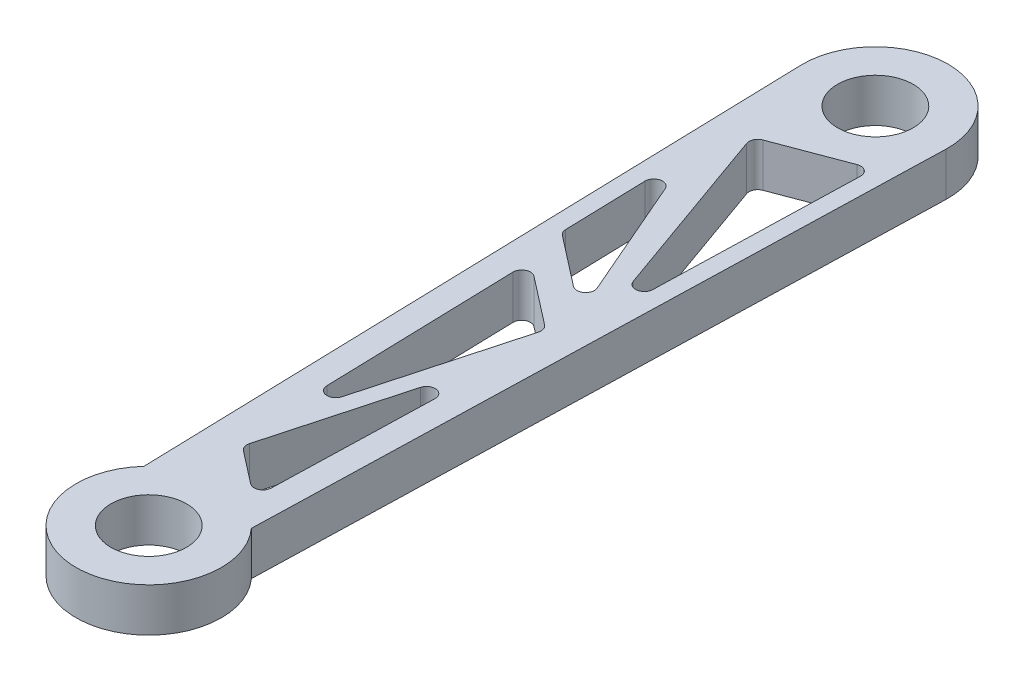
ISO-10303-21;
HEADER;
FILE_DESCRIPTION(('STEP AP214'),'2;1');
FILE_NAME('part.step','',(''),(''),'','','');
FILE_SCHEMA(('AUTOMOTIVE_DESIGN { 1 0 10303 214 1 1 1 1 }'));
ENDSEC;
DATA;
#1=APPLICATION_CONTEXT('core data for automotive mechanical design processes');
#2=APPLICATION_PROTOCOL_DEFINITION('international standard','automotive_design',2000,#1);
#3=PRODUCT_CONTEXT('',#1,'mechanical');
#4=PRODUCT('Part','Part','',(#3));
#5=PRODUCT_RELATED_PRODUCT_CATEGORY('part','',(#4));
#6=PRODUCT_DEFINITION_FORMATION('','',#4);
#7=PRODUCT_DEFINITION_CONTEXT('part definition',#1,'design');
#8=PRODUCT_DEFINITION('design','',#6,#7);
#9=PRODUCT_DEFINITION_SHAPE('','',#8);
#10=(LENGTH_UNIT() NAMED_UNIT(*) SI_UNIT(.MILLI.,.METRE.));
#11=(NAMED_UNIT(*) PLANE_ANGLE_UNIT() SI_UNIT($,.RADIAN.));
#12=(NAMED_UNIT(*) SI_UNIT($,.STERADIAN.) SOLID_ANGLE_UNIT());
#13=UNCERTAINTY_MEASURE_WITH_UNIT(LENGTH_MEASURE(1.E-05),#10,'distance_accuracy_value','');
#14=(GEOMETRIC_REPRESENTATION_CONTEXT(3) GLOBAL_UNCERTAINTY_ASSIGNED_CONTEXT((#13)) GLOBAL_UNIT_ASSIGNED_CONTEXT((#10,
#11,#12)) REPRESENTATION_CONTEXT('',''));
#15=CARTESIAN_POINT('',(0.,0.,0.));
#16=DIRECTION('',(0.,0.,1.));
#17=DIRECTION('',(1.,0.,0.));
#18=AXIS2_PLACEMENT_3D('',#15,#16,#17);
#19=CARTESIAN_POINT('',(0.,15.,0.));
#20=DIRECTION('',(0.,1.,0.));
#21=DIRECTION('',(0.,0.,1.));
#22=AXIS2_PLACEMENT_3D('',#19,#20,#21);
#23=PLANE('',#22);
#24=DIRECTION('',(0.028,0.,0.999607923137867));
#25=VECTOR('',#24,1.);
#26=CARTESIAN_POINT('',(-17.9929426164816,15.,0.504));
#27=LINE('',#26,#25);
#28=CARTESIAN_POINT('',(-24.9901980784467,15.,-249.3));
#29=VERTEX_POINT('',#28);
#30=CARTESIAN_POINT('',(-18.4787244605227,15.,-16.8385492935727));
#31=VERTEX_POINT('',#30);
#32=EDGE_CURVE('E241',#29,#31,#27,.T.);
#33=ORIENTED_EDGE('',*,*,#32,.T.);
#34=CARTESIAN_POINT('',(0.,15.,0.));
#35=DIRECTION('',(0.,1.,0.));
#36=DIRECTION('',(0.,0.,1.));
#37=AXIS2_PLACEMENT_3D('',#34,#35,#36);
#38=CIRCLE('',#37,25.);
#39=CARTESIAN_POINT('',(18.4787244605227,15.,-16.8385492935727));
#40=VERTEX_POINT('',#39);
#41=EDGE_CURVE('E226',#31,#40,#38,.T.);
#42=ORIENTED_EDGE('',*,*,#41,.T.);
#43=DIRECTION('',(0.028,0.,-0.999607923137867));
#44=VECTOR('',#43,1.);
#45=CARTESIAN_POINT('',(17.9929426164816,15.,0.504));
#46=LINE('',#45,#44);
#47=CARTESIAN_POINT('',(24.9901980784467,15.,-249.3));
#48=VERTEX_POINT('',#47);
#49=EDGE_CURVE('E54',#40,#48,#46,.T.);
#50=ORIENTED_EDGE('',*,*,#49,.T.);
#51=CARTESIAN_POINT('',(0.,15.,-250.));
#52=DIRECTION('',(0.,1.,0.));
#53=DIRECTION('',(0.,0.,-1.));
#54=AXIS2_PLACEMENT_3D('',#51,#52,#53);
#55=CIRCLE('',#54,25.);
#56=EDGE_CURVE('E223',#48,#29,#55,.T.);
#57=ORIENTED_EDGE('',*,*,#56,.T.);
#58=EDGE_LOOP('',(#33,#42,#50,#57));
#59=FACE_BOUND('',#58,.T.);
#60=DIRECTION('',(-0.789952118654972,0.,-0.613168533302649));
#61=VECTOR('',#60,1.);
#62=CARTESIAN_POINT('',(-13.0503430260789,15.,-144.472367447696));
#63=LINE('',#62,#61);
#64=CARTESIAN_POINT('',(8.34644282073467,15.,-127.863973742239));
#65=VERTEX_POINT('',#64);
#66=CARTESIAN_POINT('',(-8.03421610357234,15.,-140.578800843722));
#67=VERTEX_POINT('',#66);
#68=EDGE_CURVE('E257',#65,#67,#63,.T.);
#69=ORIENTED_EDGE('',*,*,#68,.F.);
#70=CARTESIAN_POINT('',(6.50693722082673,15.,-125.494117386274));
#71=DIRECTION('',(0.,1.,0.));
#72=DIRECTION('',(0.,0.,1.));
#73=AXIS2_PLACEMENT_3D('',#70,#71,#72);
#74=CIRCLE('',#73,3.);
#75=CARTESIAN_POINT('',(9.40048928643597,15.,-124.70205902756));
#76=VERTEX_POINT('',#75);
#77=EDGE_CURVE('E393',#65,#76,#74,.F.);
#78=ORIENTED_EDGE('',*,*,#77,.T.);
#79=DIRECTION('',(-0.264019452904616,0.,0.964517355203081));
#80=VECTOR('',#79,1.);
#81=CARTESIAN_POINT('',(9.60137553040454,15.,-125.43593778762));
#82=LINE('',#81,#80);
#83=CARTESIAN_POINT('',(-5.1364514497771,15.,-71.5956250986117));
#84=VERTEX_POINT('',#83);
#85=EDGE_CURVE('E325',#76,#84,#82,.T.);
#86=ORIENTED_EDGE('',*,*,#85,.T.);
#87=CARTESIAN_POINT('',(-8.03000351538634,15.,-72.3876834573255));
#88=DIRECTION('',(0.,1.,0.));
#89=DIRECTION('',(0.,0.,1.));
#90=AXIS2_PLACEMENT_3D('',#87,#88,#89);
#91=CIRCLE('',#90,3.);
#92=CARTESIAN_POINT('',(-11.0288272847999,15.,-72.3036834573255));
#93=VERTEX_POINT('',#92);
#94=EDGE_CURVE('E391',#84,#93,#91,.F.);
#95=ORIENTED_EDGE('',*,*,#94,.T.);
#96=DIRECTION('',(0.028,0.,0.999607923137867));
#97=VECTOR('',#96,1.);
#98=CARTESIAN_POINT('',(-10.1751058159417,15.,-41.8255854421963));
#99=LINE('',#98,#97);
#100=CARTESIAN_POINT('',(-12.8725454728939,15.,-138.124944487757));
#101=VERTEX_POINT('',#100);
#102=EDGE_CURVE('E331',#101,#93,#99,.T.);
#103=ORIENTED_EDGE('',*,*,#102,.F.);
#104=CARTESIAN_POINT('',(-9.87372170348028,15.,-138.208944487757));
#105=DIRECTION('',(0.,1.,0.));
#106=DIRECTION('',(0.,0.,1.));
#107=AXIS2_PLACEMENT_3D('',#104,#105,#106);
#108=CIRCLE('',#107,3.);
#109=EDGE_CURVE('E440',#101,#67,#108,.F.);
#110=ORIENTED_EDGE('',*,*,#109,.T.);
#111=EDGE_LOOP('',(#69,#78,#86,#95,#103,#110));
#112=FACE_BOUND('',#111,.T.);
#113=DIRECTION('',(0.789952118654972,0.,0.613168533302648));
#114=VECTOR('',#113,1.);
#115=CARTESIAN_POINT('',(9.74205890204631,15.,-26.365688077189));
#116=LINE('',#115,#114);
#117=CARTESIAN_POINT('',(-6.02662104066256,15.,-38.6054911288633));
#118=VERTEX_POINT('',#117);
#119=CARTESIAN_POINT('',(5.06935441375542,15.,-29.9926868407602));
#120=VERTEX_POINT('',#119);
#121=EDGE_CURVE('E342',#118,#120,#116,.T.);
#122=ORIENTED_EDGE('',*,*,#121,.F.);
#123=CARTESIAN_POINT('',(-4.18711544075462,15.,-40.9753474848282));
#124=DIRECTION('',(0.,1.,0.));
#125=DIRECTION('',(0.,0.,1.));
#126=AXIS2_PLACEMENT_3D('',#123,#124,#125);
#127=CIRCLE('',#126,3.);
#128=CARTESIAN_POINT('',(-7.08066750636386,15.,-41.767405843542));
#129=VERTEX_POINT('',#128);
#130=EDGE_CURVE('E383',#118,#129,#127,.F.);
#131=ORIENTED_EDGE('',*,*,#130,.T.);
#132=DIRECTION('',(0.264019452904616,0.,-0.964517355203082));
#133=VECTOR('',#132,1.);
#134=CARTESIAN_POINT('',(15.388479661623,15.,-123.851821070192));
#135=LINE('',#134,#133);
#136=CARTESIAN_POINT('',(5.54894809663971,15.,-87.9059888328851));
#137=VERTEX_POINT('',#136);
#138=EDGE_CURVE('E320',#129,#137,#135,.T.);
#139=ORIENTED_EDGE('',*,*,#138,.T.);
#140=CARTESIAN_POINT('',(8.44250016224896,15.,-87.1139304741712));
#141=DIRECTION('',(0.,1.,0.));
#142=DIRECTION('',(0.,0.,1.));
#143=AXIS2_PLACEMENT_3D('',#140,#141,#142);
#144=CIRCLE('',#143,3.);
#145=CARTESIAN_POINT('',(11.4413239316626,15.,-87.0299304741712));
#146=VERTEX_POINT('',#145);
#147=EDGE_CURVE('E365',#137,#146,#144,.F.);
#148=ORIENTED_EDGE('',*,*,#147,.T.);
#149=DIRECTION('',(0.028,0.,-0.999607923137867));
#150=VECTOR('',#149,1.);
#151=CARTESIAN_POINT('',(12.4949275960138,15.,-124.643879428906));
#152=LINE('',#151,#150);
#153=CARTESIAN_POINT('',(9.90768378307697,15.,-32.2785431967251));
#154=VERTEX_POINT('',#153);
#155=EDGE_CURVE('E262',#154,#146,#152,.T.);
#156=ORIENTED_EDGE('',*,*,#155,.F.);
#157=CARTESIAN_POINT('',(6.90886001366337,15.,-32.3625431967251));
#158=DIRECTION('',(0.,1.,0.));
#159=DIRECTION('',(0.,0.,1.));
#160=AXIS2_PLACEMENT_3D('',#157,#158,#159);
#161=CIRCLE('',#160,3.);
#162=EDGE_CURVE('E446',#154,#120,#161,.F.);
#163=ORIENTED_EDGE('',*,*,#162,.T.);
#164=EDGE_LOOP('',(#122,#131,#139,#148,#156,#163));
#165=FACE_BOUND('',#164,.T.);
#166=CARTESIAN_POINT('',(0.,15.,-250.));
#167=DIRECTION('',(0.,1.,0.));
#168=DIRECTION('',(0.,0.,1.));
#169=AXIS2_PLACEMENT_3D('',#166,#167,#168);
#170=CIRCLE('',#169,13.);
#171=CARTESIAN_POINT('',(0.,15.,-237.));
#172=VERTEX_POINT('',#171);
#173=EDGE_CURVE('E313',#172,#172,#170,.T.);
#174=ORIENTED_EDGE('',*,*,#173,.F.);
#175=EDGE_LOOP('',(#174));
#176=FACE_BOUND('',#175,.T.);
#177=DIRECTION('',(-0.397525373663088,0.,-0.917591182005376));
#178=VECTOR('',#177,1.);
#179=CARTESIAN_POINT('',(-17.7049416979852,15.,-203.5));
#180=LINE('',#179,#178);
#181=CARTESIAN_POINT('',(6.37692660368526,15.,-147.912831321415));
#182=VERTEX_POINT('',#181);
#183=CARTESIAN_POINT('',(-11.5175293173122,15.,-189.217854969559));
#184=VERTEX_POINT('',#183);
#185=EDGE_CURVE('E294',#182,#184,#180,.T.);
#186=ORIENTED_EDGE('',*,*,#185,.F.);
#187=CARTESIAN_POINT('',(3.62415305766913,15.,-146.720255200426));
#188=DIRECTION('',(0.,1.,0.));
#189=DIRECTION('',(0.,0.,1.));
#190=AXIS2_PLACEMENT_3D('',#187,#188,#189);
#191=CIRCLE('',#190,3.);
#192=CARTESIAN_POINT('',(1.7846474577612,15.,-144.350398844461));
#193=VERTEX_POINT('',#192);
#194=EDGE_CURVE('E455',#182,#193,#191,.F.);
#195=ORIENTED_EDGE('',*,*,#194,.T.);
#196=DIRECTION('',(0.789952118654972,0.,0.613168533302648));
#197=VECTOR('',#196,1.);
#198=CARTESIAN_POINT('',(11.0288712194541,15.,-137.174942267257));
#199=LINE('',#198,#197);
#200=CARTESIAN_POINT('',(-15.3248149033725,15.,-157.630930276462));
#201=VERTEX_POINT('',#200);
#202=EDGE_CURVE('E290',#201,#193,#199,.T.);
#203=ORIENTED_EDGE('',*,*,#202,.F.);
#204=CARTESIAN_POINT('',(-13.4853093034645,15.,-160.000786632427));
#205=DIRECTION('',(0.,1.,0.));
#206=DIRECTION('',(0.,0.,1.));
#207=AXIS2_PLACEMENT_3D('',#204,#205,#206);
#208=CIRCLE('',#207,3.);
#209=CARTESIAN_POINT('',(-16.4841330728781,15.,-159.916786632427));
#210=VERTEX_POINT('',#209);
#211=EDGE_CURVE('E463',#201,#210,#208,.F.);
#212=ORIENTED_EDGE('',*,*,#211,.T.);
#213=DIRECTION('',(0.028,0.,0.999607923137867));
#214=VECTOR('',#213,1.);
#215=CARTESIAN_POINT('',(-16.4444474873704,15.,-158.5));
#216=LINE('',#215,#214);
#217=CARTESIAN_POINT('',(-17.2691266327419,15.,-187.94127884857));
#218=VERTEX_POINT('',#217);
#219=EDGE_CURVE('E301',#218,#210,#216,.T.);
#220=ORIENTED_EDGE('',*,*,#219,.F.);
#221=CARTESIAN_POINT('',(-14.2703028633283,15.,-188.02527884857));
#222=DIRECTION('',(0.,1.,0.));
#223=DIRECTION('',(0.,0.,1.));
#224=AXIS2_PLACEMENT_3D('',#221,#222,#223);
#225=CIRCLE('',#224,3.);
#226=EDGE_CURVE('E467',#218,#184,#225,.F.);
#227=ORIENTED_EDGE('',*,*,#226,.T.);
#228=EDGE_LOOP('',(#186,#195,#203,#212,#220,#227));
#229=FACE_BOUND('',#228,.T.);
#230=DIRECTION('',(0.335469277320512,0.,0.94205114721763));
#231=VECTOR('',#230,1.);
#232=CARTESIAN_POINT('',(-12.,15.,-219.5));
#233=LINE('',#232,#231);
#234=CARTESIAN_POINT('',(-11.0122686365186,15.,-216.726293055678));
#235=VERTEX_POINT('',#234);
#236=CARTESIAN_POINT('',(10.5780075140444,15.,-156.097359822692));
#237=VERTEX_POINT('',#236);
#238=EDGE_CURVE('E269',#235,#237,#233,.T.);
#239=ORIENTED_EDGE('',*,*,#238,.F.);
#240=CARTESIAN_POINT('',(-8.18611519486575,15.,-217.73270088764));
#241=DIRECTION('',(0.,1.,0.));
#242=DIRECTION('',(0.,0.,1.));
#243=AXIS2_PLACEMENT_3D('',#240,#241,#242);
#244=CIRCLE('',#243,3.);
#245=CARTESIAN_POINT('',(-9.24527953761205,15.,-220.539508842427));
#246=VERTEX_POINT('',#245);
#247=EDGE_CURVE('E471',#235,#246,#244,.F.);
#248=ORIENTED_EDGE('',*,*,#247,.T.);
#249=DIRECTION('',(-0.93560265159562,0.,0.353054780915433));
#250=VECTOR('',#249,1.);
#251=CARTESIAN_POINT('',(18.4752437155831,15.,-231.));
#252=LINE('',#251,#250);
#253=CARTESIAN_POINT('',(14.2920646215098,15.,-229.421454475285));
#254=VERTEX_POINT('',#253);
#255=EDGE_CURVE('E265',#254,#246,#252,.T.);
#256=ORIENTED_EDGE('',*,*,#255,.F.);
#257=CARTESIAN_POINT('',(15.3512289642561,15.,-226.614646520498));
#258=DIRECTION('',(0.,1.,0.));
#259=DIRECTION('',(0.,0.,1.));
#260=AXIS2_PLACEMENT_3D('',#257,#258,#259);
#261=CIRCLE('',#260,3.);
#262=CARTESIAN_POINT('',(18.3500527336697,15.,-226.530646520498));
#263=VERTEX_POINT('',#262);
#264=EDGE_CURVE('E475',#254,#263,#261,.F.);
#265=ORIENTED_EDGE('',*,*,#264,.T.);
#266=DIRECTION('',(0.028,0.,-0.999607923137867));
#267=VECTOR('',#266,1.);
#268=CARTESIAN_POINT('',(15.9542552943535,15.,-141.));
#269=LINE('',#268,#267);
#270=CARTESIAN_POINT('',(16.4029847251109,15.,-157.019767654654));
#271=VERTEX_POINT('',#270);
#272=EDGE_CURVE('E276',#271,#263,#269,.T.);
#273=ORIENTED_EDGE('',*,*,#272,.F.);
#274=CARTESIAN_POINT('',(13.4041609556973,15.,-157.103767654654));
#275=DIRECTION('',(0.,1.,0.));
#276=DIRECTION('',(0.,0.,1.));
#277=AXIS2_PLACEMENT_3D('',#274,#275,#276);
#278=CIRCLE('',#277,3.);
#279=EDGE_CURVE('E459',#271,#237,#278,.F.);
#280=ORIENTED_EDGE('',*,*,#279,.T.);
#281=EDGE_LOOP('',(#239,#248,#256,#265,#273,#280));
#282=FACE_BOUND('',#281,.T.);
#283=CARTESIAN_POINT('',(0.,15.,0.));
#284=DIRECTION('',(0.,1.,0.));
#285=DIRECTION('',(0.,0.,1.));
#286=AXIS2_PLACEMENT_3D('',#283,#284,#285);
#287=CIRCLE('',#286,13.);
#288=CARTESIAN_POINT('',(0.,15.,13.));
#289=VERTEX_POINT('',#288);
#290=EDGE_CURVE('E419',#289,#289,#287,.T.);
#291=ORIENTED_EDGE('',*,*,#290,.F.);
#292=EDGE_LOOP('',(#291));
#293=FACE_BOUND('',#292,.T.);
#294=ADVANCED_FACE('F39',(#59,#112,#165,#176,#229,#282,#293),#23,.T.);
#295=CARTESIAN_POINT('',(0.,0.,0.));
#296=DIRECTION('',(0.,1.,0.));
#297=DIRECTION('',(0.,0.,1.));
#298=AXIS2_PLACEMENT_3D('',#295,#296,#297);
#299=PLANE('',#298);
#300=DIRECTION('',(0.028,0.,0.999607923137867));
#301=VECTOR('',#300,1.);
#302=CARTESIAN_POINT('',(-10.1751058159417,0.,-41.8255854421963));
#303=LINE('',#302,#301);
#304=CARTESIAN_POINT('',(-12.8725454728939,0.,-138.124944487757));
#305=VERTEX_POINT('',#304);
#306=CARTESIAN_POINT('',(-11.0288272847999,0.,-72.3036834573255));
#307=VERTEX_POINT('',#306);
#308=EDGE_CURVE('E261',#305,#307,#303,.T.);
#309=ORIENTED_EDGE('',*,*,#308,.T.);
#310=CARTESIAN_POINT('',(-8.03000351538634,0.,-72.3876834573255));
#311=DIRECTION('',(0.,1.,0.));
#312=DIRECTION('',(0.,0.,1.));
#313=AXIS2_PLACEMENT_3D('',#310,#311,#312);
#314=CIRCLE('',#313,3.);
#315=CARTESIAN_POINT('',(-5.1364514497771,0.,-71.5956250986117));
#316=VERTEX_POINT('',#315);
#317=EDGE_CURVE('E389',#307,#316,#314,.T.);
#318=ORIENTED_EDGE('',*,*,#317,.T.);
#319=DIRECTION('',(0.264019452904616,0.,-0.964517355203081));
#320=VECTOR('',#319,1.);
#321=CARTESIAN_POINT('',(9.60137553040454,0.,-125.43593778762));
#322=LINE('',#321,#320);
#323=CARTESIAN_POINT('',(9.40048928643597,0.,-124.70205902756));
#324=VERTEX_POINT('',#323);
#325=EDGE_CURVE('E328',#316,#324,#322,.T.);
#326=ORIENTED_EDGE('',*,*,#325,.T.);
#327=CARTESIAN_POINT('',(6.50693722082673,0.,-125.494117386274));
#328=DIRECTION('',(0.,1.,0.));
#329=DIRECTION('',(0.,0.,1.));
#330=AXIS2_PLACEMENT_3D('',#327,#328,#329);
#331=CIRCLE('',#330,3.);
#332=CARTESIAN_POINT('',(8.34644282073467,0.,-127.863973742239));
#333=VERTEX_POINT('',#332);
#334=EDGE_CURVE('E47',#324,#333,#331,.T.);
#335=ORIENTED_EDGE('',*,*,#334,.T.);
#336=DIRECTION('',(-0.789952118654972,0.,-0.613168533302649));
#337=VECTOR('',#336,1.);
#338=CARTESIAN_POINT('',(-13.0503430260789,0.,-144.472367447696));
#339=LINE('',#338,#337);
#340=CARTESIAN_POINT('',(-8.03421610357234,0.,-140.578800843722));
#341=VERTEX_POINT('',#340);
#342=EDGE_CURVE('E285',#333,#341,#339,.T.);
#343=ORIENTED_EDGE('',*,*,#342,.T.);
#344=CARTESIAN_POINT('',(-9.87372170348028,0.,-138.208944487757));
#345=DIRECTION('',(0.,1.,0.));
#346=DIRECTION('',(0.,0.,1.));
#347=AXIS2_PLACEMENT_3D('',#344,#345,#346);
#348=CIRCLE('',#347,3.);
#349=EDGE_CURVE('E438',#341,#305,#348,.T.);
#350=ORIENTED_EDGE('',*,*,#349,.T.);
#351=EDGE_LOOP('',(#309,#318,#326,#335,#343,#350));
#352=FACE_BOUND('',#351,.T.);
#353=DIRECTION('',(0.028,0.,-0.999607923137867));
#354=VECTOR('',#353,1.);
#355=CARTESIAN_POINT('',(12.4949275960138,0.,-124.643879428906));
#356=LINE('',#355,#354);
#357=CARTESIAN_POINT('',(9.90768378307697,0.,-32.2785431967251));
#358=VERTEX_POINT('',#357);
#359=CARTESIAN_POINT('',(11.4413239316626,0.,-87.0299304741712));
#360=VERTEX_POINT('',#359);
#361=EDGE_CURVE('E336',#358,#360,#356,.T.);
#362=ORIENTED_EDGE('',*,*,#361,.T.);
#363=CARTESIAN_POINT('',(8.44250016224896,0.,-87.1139304741712));
#364=DIRECTION('',(0.,1.,0.));
#365=DIRECTION('',(0.,0.,1.));
#366=AXIS2_PLACEMENT_3D('',#363,#364,#365);
#367=CIRCLE('',#366,3.);
#368=CARTESIAN_POINT('',(5.54894809663971,0.,-87.9059888328851));
#369=VERTEX_POINT('',#368);
#370=EDGE_CURVE('E366',#360,#369,#367,.T.);
#371=ORIENTED_EDGE('',*,*,#370,.T.);
#372=DIRECTION('',(-0.264019452904616,0.,0.964517355203082));
#373=VECTOR('',#372,1.);
#374=CARTESIAN_POINT('',(15.388479661623,0.,-123.851821070192));
#375=LINE('',#374,#373);
#376=CARTESIAN_POINT('',(-7.08066750636386,0.,-41.767405843542));
#377=VERTEX_POINT('',#376);
#378=EDGE_CURVE('E324',#369,#377,#375,.T.);
#379=ORIENTED_EDGE('',*,*,#378,.T.);
#380=CARTESIAN_POINT('',(-4.18711544075462,0.,-40.9753474848282));
#381=DIRECTION('',(0.,1.,0.));
#382=DIRECTION('',(0.,0.,1.));
#383=AXIS2_PLACEMENT_3D('',#380,#381,#382);
#384=CIRCLE('',#383,3.);
#385=CARTESIAN_POINT('',(-6.02662104066256,0.,-38.6054911288633));
#386=VERTEX_POINT('',#385);
#387=EDGE_CURVE('E385',#377,#386,#384,.T.);
#388=ORIENTED_EDGE('',*,*,#387,.T.);
#389=DIRECTION('',(0.789952118654972,0.,0.613168533302648));
#390=VECTOR('',#389,1.);
#391=CARTESIAN_POINT('',(9.74205890204631,0.,-26.365688077189));
#392=LINE('',#391,#390);
#393=CARTESIAN_POINT('',(5.06935441375542,0.,-29.9926868407602));
#394=VERTEX_POINT('',#393);
#395=EDGE_CURVE('E334',#386,#394,#392,.T.);
#396=ORIENTED_EDGE('',*,*,#395,.T.);
#397=CARTESIAN_POINT('',(6.90886001366337,0.,-32.3625431967251));
#398=DIRECTION('',(0.,1.,0.));
#399=DIRECTION('',(0.,0.,1.));
#400=AXIS2_PLACEMENT_3D('',#397,#398,#399);
#401=CIRCLE('',#400,3.);
#402=EDGE_CURVE('E444',#394,#358,#401,.T.);
#403=ORIENTED_EDGE('',*,*,#402,.T.);
#404=EDGE_LOOP('',(#362,#371,#379,#388,#396,#403));
#405=FACE_BOUND('',#404,.T.);
#406=DIRECTION('',(0.028,0.,0.999607923137867));
#407=VECTOR('',#406,1.);
#408=CARTESIAN_POINT('',(-16.4444474873704,0.,-158.5));
#409=LINE('',#408,#407);
#410=CARTESIAN_POINT('',(-17.2691266327419,0.,-187.94127884857));
#411=VERTEX_POINT('',#410);
#412=CARTESIAN_POINT('',(-16.4841330728781,0.,-159.916786632427));
#413=VERTEX_POINT('',#412);
#414=EDGE_CURVE('E295',#411,#413,#409,.T.);
#415=ORIENTED_EDGE('',*,*,#414,.T.);
#416=CARTESIAN_POINT('',(-13.4853093034645,0.,-160.000786632427));
#417=DIRECTION('',(0.,1.,0.));
#418=DIRECTION('',(0.,0.,1.));
#419=AXIS2_PLACEMENT_3D('',#416,#417,#418);
#420=CIRCLE('',#419,3.);
#421=CARTESIAN_POINT('',(-15.3248149033725,0.,-157.630930276462));
#422=VERTEX_POINT('',#421);
#423=EDGE_CURVE('E465',#413,#422,#420,.T.);
#424=ORIENTED_EDGE('',*,*,#423,.T.);
#425=DIRECTION('',(0.789952118654972,0.,0.613168533302648));
#426=VECTOR('',#425,1.);
#427=CARTESIAN_POINT('',(11.0288712194541,0.,-137.174942267257));
#428=LINE('',#427,#426);
#429=CARTESIAN_POINT('',(1.7846474577612,0.,-144.350398844461));
#430=VERTEX_POINT('',#429);
#431=EDGE_CURVE('E280',#422,#430,#428,.T.);
#432=ORIENTED_EDGE('',*,*,#431,.T.);
#433=CARTESIAN_POINT('',(3.62415305766913,0.,-146.720255200426));
#434=DIRECTION('',(0.,1.,0.));
#435=DIRECTION('',(0.,0.,1.));
#436=AXIS2_PLACEMENT_3D('',#433,#434,#435);
#437=CIRCLE('',#436,3.);
#438=CARTESIAN_POINT('',(6.37692660368526,0.,-147.912831321415));
#439=VERTEX_POINT('',#438);
#440=EDGE_CURVE('E457',#430,#439,#437,.T.);
#441=ORIENTED_EDGE('',*,*,#440,.T.);
#442=DIRECTION('',(-0.397525373663088,0.,-0.917591182005376));
#443=VECTOR('',#442,1.);
#444=CARTESIAN_POINT('',(-17.7049416979852,0.,-203.5));
#445=LINE('',#444,#443);
#446=CARTESIAN_POINT('',(-11.5175293173122,0.,-189.217854969559));
#447=VERTEX_POINT('',#446);
#448=EDGE_CURVE('E308',#439,#447,#445,.T.);
#449=ORIENTED_EDGE('',*,*,#448,.T.);
#450=CARTESIAN_POINT('',(-14.2703028633283,0.,-188.02527884857));
#451=DIRECTION('',(0.,1.,0.));
#452=DIRECTION('',(0.,0.,1.));
#453=AXIS2_PLACEMENT_3D('',#450,#451,#452);
#454=CIRCLE('',#453,3.);
#455=EDGE_CURVE('E469',#447,#411,#454,.T.);
#456=ORIENTED_EDGE('',*,*,#455,.T.);
#457=EDGE_LOOP('',(#415,#424,#432,#441,#449,#456));
#458=FACE_BOUND('',#457,.T.);
#459=DIRECTION('',(0.028,0.,-0.999607923137867));
#460=VECTOR('',#459,1.);
#461=CARTESIAN_POINT('',(17.9929426164816,0.,0.504));
#462=LINE('',#461,#460);
#463=CARTESIAN_POINT('',(18.4787244605227,0.,-16.8385492935727));
#464=VERTEX_POINT('',#463);
#465=CARTESIAN_POINT('',(24.9901980784467,0.,-249.3));
#466=VERTEX_POINT('',#465);
#467=EDGE_CURVE('E232',#464,#466,#462,.T.);
#468=ORIENTED_EDGE('',*,*,#467,.F.);
#469=CARTESIAN_POINT('',(0.,0.,0.));
#470=DIRECTION('',(0.,1.,0.));
#471=DIRECTION('',(0.,0.,1.));
#472=AXIS2_PLACEMENT_3D('',#469,#470,#471);
#473=CIRCLE('',#472,25.);
#474=CARTESIAN_POINT('',(-18.4787244605227,0.,-16.8385492935727));
#475=VERTEX_POINT('',#474);
#476=EDGE_CURVE('E519',#464,#475,#473,.F.);
#477=ORIENTED_EDGE('',*,*,#476,.T.);
#478=DIRECTION('',(0.028,0.,0.999607923137867));
#479=VECTOR('',#478,1.);
#480=CARTESIAN_POINT('',(-17.9929426164816,0.,0.504));
#481=LINE('',#480,#479);
#482=CARTESIAN_POINT('',(-24.9901980784467,0.,-249.3));
#483=VERTEX_POINT('',#482);
#484=EDGE_CURVE('E227',#483,#475,#481,.T.);
#485=ORIENTED_EDGE('',*,*,#484,.F.);
#486=CARTESIAN_POINT('',(0.,0.,-250.));
#487=DIRECTION('',(0.,1.,0.));
#488=DIRECTION('',(0.,0.,-1.));
#489=AXIS2_PLACEMENT_3D('',#486,#487,#488);
#490=CIRCLE('',#489,25.);
#491=EDGE_CURVE('E510',#466,#483,#490,.T.);
#492=ORIENTED_EDGE('',*,*,#491,.F.);
#493=EDGE_LOOP('',(#468,#477,#485,#492));
#494=FACE_BOUND('',#493,.T.);
#495=CARTESIAN_POINT('',(0.,0.,-250.));
#496=DIRECTION('',(0.,1.,0.));
#497=DIRECTION('',(0.,0.,1.));
#498=AXIS2_PLACEMENT_3D('',#495,#496,#497);
#499=CIRCLE('',#498,13.);
#500=CARTESIAN_POINT('',(0.,0.,-237.));
#501=VERTEX_POINT('',#500);
#502=EDGE_CURVE('E305',#501,#501,#499,.T.);
#503=ORIENTED_EDGE('',*,*,#502,.T.);
#504=EDGE_LOOP('',(#503));
#505=FACE_BOUND('',#504,.T.);
#506=DIRECTION('',(0.028,0.,-0.999607923137867));
#507=VECTOR('',#506,1.);
#508=CARTESIAN_POINT('',(15.9542552943535,0.,-141.));
#509=LINE('',#508,#507);
#510=CARTESIAN_POINT('',(16.4029847251109,0.,-157.019767654654));
#511=VERTEX_POINT('',#510);
#512=CARTESIAN_POINT('',(18.3500527336697,0.,-226.530646520498));
#513=VERTEX_POINT('',#512);
#514=EDGE_CURVE('E270',#511,#513,#509,.T.);
#515=ORIENTED_EDGE('',*,*,#514,.T.);
#516=CARTESIAN_POINT('',(15.3512289642561,0.,-226.614646520498));
#517=DIRECTION('',(0.,1.,0.));
#518=DIRECTION('',(0.,0.,1.));
#519=AXIS2_PLACEMENT_3D('',#516,#517,#518);
#520=CIRCLE('',#519,3.);
#521=CARTESIAN_POINT('',(14.2920646215098,0.,-229.421454475285));
#522=VERTEX_POINT('',#521);
#523=EDGE_CURVE('E477',#513,#522,#520,.T.);
#524=ORIENTED_EDGE('',*,*,#523,.T.);
#525=DIRECTION('',(-0.93560265159562,0.,0.353054780915433));
#526=VECTOR('',#525,1.);
#527=CARTESIAN_POINT('',(18.4752437155831,0.,-231.));
#528=LINE('',#527,#526);
#529=CARTESIAN_POINT('',(-9.24527953761205,0.,-220.539508842427));
#530=VERTEX_POINT('',#529);
#531=EDGE_CURVE('E281',#522,#530,#528,.T.);
#532=ORIENTED_EDGE('',*,*,#531,.T.);
#533=CARTESIAN_POINT('',(-8.18611519486575,0.,-217.73270088764));
#534=DIRECTION('',(0.,1.,0.));
#535=DIRECTION('',(0.,0.,1.));
#536=AXIS2_PLACEMENT_3D('',#533,#534,#535);
#537=CIRCLE('',#536,3.);
#538=CARTESIAN_POINT('',(-11.0122686365186,0.,-216.726293055678));
#539=VERTEX_POINT('',#538);
#540=EDGE_CURVE('E473',#530,#539,#537,.T.);
#541=ORIENTED_EDGE('',*,*,#540,.T.);
#542=DIRECTION('',(0.335469277320512,0.,0.94205114721763));
#543=VECTOR('',#542,1.);
#544=CARTESIAN_POINT('',(-12.,0.,-219.5));
#545=LINE('',#544,#543);
#546=CARTESIAN_POINT('',(10.5780075140444,0.,-156.097359822692));
#547=VERTEX_POINT('',#546);
#548=EDGE_CURVE('E284',#539,#547,#545,.T.);
#549=ORIENTED_EDGE('',*,*,#548,.T.);
#550=CARTESIAN_POINT('',(13.4041609556973,0.,-157.103767654654));
#551=DIRECTION('',(0.,1.,0.));
#552=DIRECTION('',(0.,0.,1.));
#553=AXIS2_PLACEMENT_3D('',#550,#551,#552);
#554=CIRCLE('',#553,3.);
#555=EDGE_CURVE('E461',#547,#511,#554,.T.);
#556=ORIENTED_EDGE('',*,*,#555,.T.);
#557=EDGE_LOOP('',(#515,#524,#532,#541,#549,#556));
#558=FACE_BOUND('',#557,.T.);
#559=CARTESIAN_POINT('',(0.,0.,0.));
#560=DIRECTION('',(0.,1.,0.));
#561=DIRECTION('',(0.,0.,1.));
#562=AXIS2_PLACEMENT_3D('',#559,#560,#561);
#563=CIRCLE('',#562,13.);
#564=CARTESIAN_POINT('',(0.,0.,13.));
#565=VERTEX_POINT('',#564);
#566=EDGE_CURVE('E417',#565,#565,#563,.T.);
#567=ORIENTED_EDGE('',*,*,#566,.T.);
#568=EDGE_LOOP('',(#567));
#569=FACE_BOUND('',#568,.T.);
#570=ADVANCED_FACE('F397',(#352,#405,#458,#494,#505,#558,#569),#299,.F.);
#571=CARTESIAN_POINT('',(17.9929426164816,15.,0.504));
#572=DIRECTION('',(-0.999607923137867,0.,-0.028));
#573=DIRECTION('',(-0.028,0.,0.999607923137867));
#574=AXIS2_PLACEMENT_3D('',#571,#572,#573);
#575=PLANE('',#574);
#576=ORIENTED_EDGE('',*,*,#49,.F.);
#577=DIRECTION('',(0.,1.,0.));
#578=VECTOR('',#577,1.);
#579=CARTESIAN_POINT('',(18.4787244605227,-70.7106781186548,-16.8385492935727));
#580=LINE('',#579,#578);
#581=EDGE_CURVE('E58',#40,#464,#580,.F.);
#582=ORIENTED_EDGE('',*,*,#581,.T.);
#583=ORIENTED_EDGE('',*,*,#467,.T.);
#584=DIRECTION('',(0.,-1.,0.));
#585=VECTOR('',#584,1.);
#586=CARTESIAN_POINT('',(24.9901980784467,15.,-249.3));
#587=LINE('',#586,#585);
#588=EDGE_CURVE('E230',#48,#466,#587,.T.);
#589=ORIENTED_EDGE('',*,*,#588,.F.);
#590=EDGE_LOOP('',(#576,#582,#583,#589));
#591=FACE_BOUND('',#590,.T.);
#592=ADVANCED_FACE('F231',(#591),#575,.F.);
#593=CARTESIAN_POINT('',(0.,15.,-250.));
#594=DIRECTION('',(0.,-1.,0.));
#595=DIRECTION('',(0.,0.,-1.));
#596=AXIS2_PLACEMENT_3D('',#593,#594,#595);
#597=CYLINDRICAL_SURFACE('',#596,25.);
#598=ORIENTED_EDGE('',*,*,#491,.T.);
#599=DIRECTION('',(0.,-1.,0.));
#600=VECTOR('',#599,1.);
#601=CARTESIAN_POINT('',(-24.9901980784467,15.,-249.3));
#602=LINE('',#601,#600);
#603=EDGE_CURVE('E236',#29,#483,#602,.T.);
#604=ORIENTED_EDGE('',*,*,#603,.F.);
#605=ORIENTED_EDGE('',*,*,#56,.F.);
#606=ORIENTED_EDGE('',*,*,#588,.T.);
#607=EDGE_LOOP('',(#598,#604,#605,#606));
#608=FACE_BOUND('',#607,.T.);
#609=ADVANCED_FACE('F238',(#608),#597,.T.);
#610=CARTESIAN_POINT('',(-17.9929426164816,15.,0.504));
#611=DIRECTION('',(0.999607923137867,0.,-0.028));
#612=DIRECTION('',(-0.028,0.,-0.999607923137867));
#613=AXIS2_PLACEMENT_3D('',#610,#611,#612);
#614=PLANE('',#613);
#615=ORIENTED_EDGE('',*,*,#484,.T.);
#616=DIRECTION('',(0.,1.,0.));
#617=VECTOR('',#616,1.);
#618=CARTESIAN_POINT('',(-18.4787244605227,-70.7106781186548,-16.8385492935727));
#619=LINE('',#618,#617);
#620=EDGE_CURVE('E12',#475,#31,#619,.T.);
#621=ORIENTED_EDGE('',*,*,#620,.T.);
#622=ORIENTED_EDGE('',*,*,#32,.F.);
#623=ORIENTED_EDGE('',*,*,#603,.T.);
#624=EDGE_LOOP('',(#615,#621,#622,#623));
#625=FACE_BOUND('',#624,.T.);
#626=ADVANCED_FACE('F514',(#625),#614,.F.);
#627=CARTESIAN_POINT('',(0.,15.,-250.));
#628=DIRECTION('',(0.,-1.,0.));
#629=DIRECTION('',(0.,0.,-1.));
#630=AXIS2_PLACEMENT_3D('',#627,#628,#629);
#631=CYLINDRICAL_SURFACE('',#630,13.);
#632=ORIENTED_EDGE('',*,*,#173,.T.);
#633=EDGE_LOOP('',(#632));
#634=FACE_BOUND('',#633,.T.);
#635=ORIENTED_EDGE('',*,*,#502,.F.);
#636=EDGE_LOOP('',(#635));
#637=FACE_BOUND('',#636,.T.);
#638=ADVANCED_FACE('F540',(#634,#637),#631,.F.);
#639=CARTESIAN_POINT('',(11.0288712194541,15.,-137.174942267257));
#640=DIRECTION('',(0.613168533302648,0.,-0.789952118654972));
#641=DIRECTION('',(-0.789952118654972,0.,-0.613168533302648));
#642=AXIS2_PLACEMENT_3D('',#639,#640,#641);
#643=PLANE('',#642);
#644=ORIENTED_EDGE('',*,*,#431,.F.);
#645=DIRECTION('',(0.,-1.,0.));
#646=VECTOR('',#645,1.);
#647=CARTESIAN_POINT('',(-15.3248149033725,15.,-157.630930276462));
#648=LINE('',#647,#646);
#649=EDGE_CURVE('E479',#422,#201,#648,.F.);
#650=ORIENTED_EDGE('',*,*,#649,.T.);
#651=ORIENTED_EDGE('',*,*,#202,.T.);
#652=DIRECTION('',(0.,-1.,0.));
#653=VECTOR('',#652,1.);
#654=CARTESIAN_POINT('',(1.78464745776119,0.,-144.350398844461));
#655=LINE('',#654,#653);
#656=EDGE_CURVE('E481',#193,#430,#655,.T.);
#657=ORIENTED_EDGE('',*,*,#656,.T.);
#658=EDGE_LOOP('',(#644,#650,#651,#657));
#659=FACE_BOUND('',#658,.T.);
#660=ADVANCED_FACE('F625',(#659),#643,.T.);
#661=CARTESIAN_POINT('',(-17.7049416979852,15.,-203.5));
#662=DIRECTION('',(-0.917591182005376,0.,0.397525373663088));
#663=DIRECTION('',(0.397525373663088,0.,0.917591182005376));
#664=AXIS2_PLACEMENT_3D('',#661,#662,#663);
#665=PLANE('',#664);
#666=ORIENTED_EDGE('',*,*,#185,.T.);
#667=DIRECTION('',(0.,-1.,0.));
#668=VECTOR('',#667,1.);
#669=CARTESIAN_POINT('',(-11.5175293173122,0.,-189.217854969559));
#670=LINE('',#669,#668);
#671=EDGE_CURVE('E489',#184,#447,#670,.T.);
#672=ORIENTED_EDGE('',*,*,#671,.T.);
#673=ORIENTED_EDGE('',*,*,#448,.F.);
#674=DIRECTION('',(0.,-1.,0.));
#675=VECTOR('',#674,1.);
#676=CARTESIAN_POINT('',(6.37692660368527,15.,-147.912831321415));
#677=LINE('',#676,#675);
#678=EDGE_CURVE('E492',#439,#182,#677,.F.);
#679=ORIENTED_EDGE('',*,*,#678,.T.);
#680=EDGE_LOOP('',(#666,#672,#673,#679));
#681=FACE_BOUND('',#680,.T.);
#682=ADVANCED_FACE('F622',(#681),#665,.T.);
#683=CARTESIAN_POINT('',(-16.4444474873704,15.,-158.5));
#684=DIRECTION('',(0.999607923137867,0.,-0.028));
#685=DIRECTION('',(-0.028,0.,-0.999607923137867));
#686=AXIS2_PLACEMENT_3D('',#683,#684,#685);
#687=PLANE('',#686);
#688=ORIENTED_EDGE('',*,*,#414,.F.);
#689=DIRECTION('',(0.,-1.,0.));
#690=VECTOR('',#689,1.);
#691=CARTESIAN_POINT('',(-17.2691266327419,15.,-187.94127884857));
#692=LINE('',#691,#690);
#693=EDGE_CURVE('E484',#411,#218,#692,.F.);
#694=ORIENTED_EDGE('',*,*,#693,.T.);
#695=ORIENTED_EDGE('',*,*,#219,.T.);
#696=DIRECTION('',(0.,-1.,0.));
#697=VECTOR('',#696,1.);
#698=CARTESIAN_POINT('',(-16.4841330728781,0.,-159.916786632427));
#699=LINE('',#698,#697);
#700=EDGE_CURVE('E486',#210,#413,#699,.T.);
#701=ORIENTED_EDGE('',*,*,#700,.T.);
#702=EDGE_LOOP('',(#688,#694,#695,#701));
#703=FACE_BOUND('',#702,.T.);
#704=ADVANCED_FACE('F618',(#703),#687,.T.);
#705=CARTESIAN_POINT('',(18.4752437155831,15.,-231.));
#706=DIRECTION('',(0.353054780915433,0.,0.93560265159562));
#707=DIRECTION('',(0.93560265159562,0.,-0.353054780915433));
#708=AXIS2_PLACEMENT_3D('',#705,#706,#707);
#709=PLANE('',#708);
#710=ORIENTED_EDGE('',*,*,#531,.F.);
#711=DIRECTION('',(0.,-1.,0.));
#712=VECTOR('',#711,1.);
#713=CARTESIAN_POINT('',(14.2920646215098,15.,-229.421454475285));
#714=LINE('',#713,#712);
#715=EDGE_CURVE('E499',#522,#254,#714,.F.);
#716=ORIENTED_EDGE('',*,*,#715,.T.);
#717=ORIENTED_EDGE('',*,*,#255,.T.);
#718=DIRECTION('',(0.,-1.,0.));
#719=VECTOR('',#718,1.);
#720=CARTESIAN_POINT('',(-9.24527953761205,0.,-220.539508842427));
#721=LINE('',#720,#719);
#722=EDGE_CURVE('E501',#246,#530,#721,.T.);
#723=ORIENTED_EDGE('',*,*,#722,.T.);
#724=EDGE_LOOP('',(#710,#716,#717,#723));
#725=FACE_BOUND('',#724,.T.);
#726=ADVANCED_FACE('F614',(#725),#709,.T.);
#727=CARTESIAN_POINT('',(-12.,15.,-219.5));
#728=DIRECTION('',(0.94205114721763,0.,-0.335469277320512));
#729=DIRECTION('',(-0.335469277320512,0.,-0.94205114721763));
#730=AXIS2_PLACEMENT_3D('',#727,#728,#729);
#731=PLANE('',#730);
#732=ORIENTED_EDGE('',*,*,#548,.F.);
#733=DIRECTION('',(0.,-1.,0.));
#734=VECTOR('',#733,1.);
#735=CARTESIAN_POINT('',(-11.0122686365186,15.,-216.726293055678));
#736=LINE('',#735,#734);
#737=EDGE_CURVE('E494',#539,#235,#736,.F.);
#738=ORIENTED_EDGE('',*,*,#737,.T.);
#739=ORIENTED_EDGE('',*,*,#238,.T.);
#740=DIRECTION('',(0.,-1.,0.));
#741=VECTOR('',#740,1.);
#742=CARTESIAN_POINT('',(10.5780075140444,0.,-156.097359822692));
#743=LINE('',#742,#741);
#744=EDGE_CURVE('E496',#237,#547,#743,.T.);
#745=ORIENTED_EDGE('',*,*,#744,.T.);
#746=EDGE_LOOP('',(#732,#738,#739,#745));
#747=FACE_BOUND('',#746,.T.);
#748=ADVANCED_FACE('F610',(#747),#731,.T.);
#749=CARTESIAN_POINT('',(15.9542552943535,15.,-141.));
#750=DIRECTION('',(-0.999607923137867,0.,-0.028));
#751=DIRECTION('',(-0.028,0.,0.999607923137867));
#752=AXIS2_PLACEMENT_3D('',#749,#750,#751);
#753=PLANE('',#752);
#754=ORIENTED_EDGE('',*,*,#272,.T.);
#755=DIRECTION('',(0.,-1.,0.));
#756=VECTOR('',#755,1.);
#757=CARTESIAN_POINT('',(18.3500527336697,0.,-226.530646520498));
#758=LINE('',#757,#756);
#759=EDGE_CURVE('E504',#263,#513,#758,.T.);
#760=ORIENTED_EDGE('',*,*,#759,.T.);
#761=ORIENTED_EDGE('',*,*,#514,.F.);
#762=DIRECTION('',(0.,-1.,0.));
#763=VECTOR('',#762,1.);
#764=CARTESIAN_POINT('',(16.4029847251109,15.,-157.019767654654));
#765=LINE('',#764,#763);
#766=EDGE_CURVE('E235',#511,#271,#765,.F.);
#767=ORIENTED_EDGE('',*,*,#766,.T.);
#768=EDGE_LOOP('',(#754,#760,#761,#767));
#769=FACE_BOUND('',#768,.T.);
#770=ADVANCED_FACE('F553',(#769),#753,.T.);
#771=CARTESIAN_POINT('',(15.3512289642561,15.,-226.614646520498));
#772=DIRECTION('',(0.,1.,0.));
#773=DIRECTION('',(0.,0.,1.));
#774=AXIS2_PLACEMENT_3D('',#771,#772,#773);
#775=CYLINDRICAL_SURFACE('',#774,3.);
#776=ORIENTED_EDGE('',*,*,#264,.F.);
#777=ORIENTED_EDGE('',*,*,#715,.F.);
#778=ORIENTED_EDGE('',*,*,#523,.F.);
#779=ORIENTED_EDGE('',*,*,#759,.F.);
#780=EDGE_LOOP('',(#776,#777,#778,#779));
#781=FACE_BOUND('',#780,.T.);
#782=ADVANCED_FACE('F549',(#781),#775,.F.);
#783=CARTESIAN_POINT('',(-8.18611519486575,15.,-217.73270088764));
#784=DIRECTION('',(0.,1.,0.));
#785=DIRECTION('',(0.,0.,1.));
#786=AXIS2_PLACEMENT_3D('',#783,#784,#785);
#787=CYLINDRICAL_SURFACE('',#786,3.);
#788=ORIENTED_EDGE('',*,*,#247,.F.);
#789=ORIENTED_EDGE('',*,*,#737,.F.);
#790=ORIENTED_EDGE('',*,*,#540,.F.);
#791=ORIENTED_EDGE('',*,*,#722,.F.);
#792=EDGE_LOOP('',(#788,#789,#790,#791));
#793=FACE_BOUND('',#792,.T.);
#794=ADVANCED_FACE('F552',(#793),#787,.F.);
#795=CARTESIAN_POINT('',(-14.2703028633283,15.,-188.02527884857));
#796=DIRECTION('',(0.,1.,0.));
#797=DIRECTION('',(0.,0.,1.));
#798=AXIS2_PLACEMENT_3D('',#795,#796,#797);
#799=CYLINDRICAL_SURFACE('',#798,3.);
#800=ORIENTED_EDGE('',*,*,#226,.F.);
#801=ORIENTED_EDGE('',*,*,#693,.F.);
#802=ORIENTED_EDGE('',*,*,#455,.F.);
#803=ORIENTED_EDGE('',*,*,#671,.F.);
#804=EDGE_LOOP('',(#800,#801,#802,#803));
#805=FACE_BOUND('',#804,.T.);
#806=ADVANCED_FACE('F557',(#805),#799,.F.);
#807=CARTESIAN_POINT('',(-13.4853093034645,15.,-160.000786632427));
#808=DIRECTION('',(0.,1.,0.));
#809=DIRECTION('',(0.,0.,1.));
#810=AXIS2_PLACEMENT_3D('',#807,#808,#809);
#811=CYLINDRICAL_SURFACE('',#810,3.);
#812=ORIENTED_EDGE('',*,*,#211,.F.);
#813=ORIENTED_EDGE('',*,*,#649,.F.);
#814=ORIENTED_EDGE('',*,*,#423,.F.);
#815=ORIENTED_EDGE('',*,*,#700,.F.);
#816=EDGE_LOOP('',(#812,#813,#814,#815));
#817=FACE_BOUND('',#816,.T.);
#818=ADVANCED_FACE('F561',(#817),#811,.F.);
#819=CARTESIAN_POINT('',(13.4041609556973,15.,-157.103767654654));
#820=DIRECTION('',(0.,1.,0.));
#821=DIRECTION('',(0.,0.,1.));
#822=AXIS2_PLACEMENT_3D('',#819,#820,#821);
#823=CYLINDRICAL_SURFACE('',#822,3.);
#824=ORIENTED_EDGE('',*,*,#279,.F.);
#825=ORIENTED_EDGE('',*,*,#766,.F.);
#826=ORIENTED_EDGE('',*,*,#555,.F.);
#827=ORIENTED_EDGE('',*,*,#744,.F.);
#828=EDGE_LOOP('',(#824,#825,#826,#827));
#829=FACE_BOUND('',#828,.T.);
#830=ADVANCED_FACE('F565',(#829),#823,.F.);
#831=CARTESIAN_POINT('',(3.62415305766913,15.,-146.720255200426));
#832=DIRECTION('',(0.,1.,0.));
#833=DIRECTION('',(0.,0.,1.));
#834=AXIS2_PLACEMENT_3D('',#831,#832,#833);
#835=CYLINDRICAL_SURFACE('',#834,3.);
#836=ORIENTED_EDGE('',*,*,#194,.F.);
#837=ORIENTED_EDGE('',*,*,#678,.F.);
#838=ORIENTED_EDGE('',*,*,#440,.F.);
#839=ORIENTED_EDGE('',*,*,#656,.F.);
#840=EDGE_LOOP('',(#836,#837,#838,#839));
#841=FACE_BOUND('',#840,.T.);
#842=ADVANCED_FACE('F569',(#841),#835,.F.);
#843=CARTESIAN_POINT('',(-10.1751058159417,0.,-41.8255854421963));
#844=DIRECTION('',(-0.999607923137867,0.,0.028));
#845=DIRECTION('',(0.028,0.,0.999607923137867));
#846=AXIS2_PLACEMENT_3D('',#843,#844,#845);
#847=PLANE('',#846);
#848=ORIENTED_EDGE('',*,*,#102,.T.);
#849=DIRECTION('',(0.,-1.,0.));
#850=VECTOR('',#849,1.);
#851=CARTESIAN_POINT('',(-11.0288272847999,0.,-72.3036834573255));
#852=LINE('',#851,#850);
#853=EDGE_CURVE('E367',#93,#307,#852,.T.);
#854=ORIENTED_EDGE('',*,*,#853,.T.);
#855=ORIENTED_EDGE('',*,*,#308,.F.);
#856=DIRECTION('',(0.,1.,0.));
#857=VECTOR('',#856,1.);
#858=CARTESIAN_POINT('',(-12.8725454728939,15.,-138.124944487757));
#859=LINE('',#858,#857);
#860=EDGE_CURVE('E449',#305,#101,#859,.T.);
#861=ORIENTED_EDGE('',*,*,#860,.T.);
#862=EDGE_LOOP('',(#848,#854,#855,#861));
#863=FACE_BOUND('',#862,.T.);
#864=ADVANCED_FACE('F573',(#863),#847,.F.);
#865=CARTESIAN_POINT('',(-13.0503430260789,0.,-144.472367447696));
#866=DIRECTION('',(0.613168533302649,0.,-0.789952118654972));
#867=DIRECTION('',(-0.789952118654972,0.,-0.613168533302649));
#868=AXIS2_PLACEMENT_3D('',#865,#866,#867);
#869=PLANE('',#868);
#870=ORIENTED_EDGE('',*,*,#342,.F.);
#871=DIRECTION('',(0.,1.,0.));
#872=VECTOR('',#871,1.);
#873=CARTESIAN_POINT('',(8.34644282073467,0.,-127.863973742239));
#874=LINE('',#873,#872);
#875=EDGE_CURVE('E380',#333,#65,#874,.T.);
#876=ORIENTED_EDGE('',*,*,#875,.T.);
#877=ORIENTED_EDGE('',*,*,#68,.T.);
#878=DIRECTION('',(0.,1.,0.));
#879=VECTOR('',#878,1.);
#880=CARTESIAN_POINT('',(-8.03421610357233,0.,-140.578800843722));
#881=LINE('',#880,#879);
#882=EDGE_CURVE('E408',#67,#341,#881,.F.);
#883=ORIENTED_EDGE('',*,*,#882,.T.);
#884=EDGE_LOOP('',(#870,#876,#877,#883));
#885=FACE_BOUND('',#884,.T.);
#886=ADVANCED_FACE('F405',(#885),#869,.F.);
#887=CARTESIAN_POINT('',(12.4949275960138,0.,-124.643879428906));
#888=DIRECTION('',(0.999607923137867,0.,0.028));
#889=DIRECTION('',(0.028,0.,-0.999607923137867));
#890=AXIS2_PLACEMENT_3D('',#887,#888,#889);
#891=PLANE('',#890);
#892=ORIENTED_EDGE('',*,*,#155,.T.);
#893=DIRECTION('',(0.,-1.,0.));
#894=VECTOR('',#893,1.);
#895=CARTESIAN_POINT('',(11.4413239316626,0.,-87.0299304741712));
#896=LINE('',#895,#894);
#897=EDGE_CURVE('E357',#146,#360,#896,.T.);
#898=ORIENTED_EDGE('',*,*,#897,.T.);
#899=ORIENTED_EDGE('',*,*,#361,.F.);
#900=DIRECTION('',(0.,1.,0.));
#901=VECTOR('',#900,1.);
#902=CARTESIAN_POINT('',(9.90768378307697,15.,-32.2785431967251));
#903=LINE('',#902,#901);
#904=EDGE_CURVE('E359',#358,#154,#903,.T.);
#905=ORIENTED_EDGE('',*,*,#904,.T.);
#906=EDGE_LOOP('',(#892,#898,#899,#905));
#907=FACE_BOUND('',#906,.T.);
#908=ADVANCED_FACE('F355',(#907),#891,.F.);
#909=CARTESIAN_POINT('',(9.74205890204631,0.,-26.365688077189));
#910=DIRECTION('',(-0.613168533302648,0.,0.789952118654972));
#911=DIRECTION('',(0.789952118654972,0.,0.613168533302648));
#912=AXIS2_PLACEMENT_3D('',#909,#910,#911);
#913=PLANE('',#912);
#914=ORIENTED_EDGE('',*,*,#395,.F.);
#915=DIRECTION('',(0.,1.,0.));
#916=VECTOR('',#915,1.);
#917=CARTESIAN_POINT('',(-6.02662104066256,0.,-38.6054911288632));
#918=LINE('',#917,#916);
#919=EDGE_CURVE('E437',#386,#118,#918,.T.);
#920=ORIENTED_EDGE('',*,*,#919,.T.);
#921=ORIENTED_EDGE('',*,*,#121,.T.);
#922=DIRECTION('',(0.,1.,0.));
#923=VECTOR('',#922,1.);
#924=CARTESIAN_POINT('',(5.06935441375542,0.,-29.9926868407602));
#925=LINE('',#924,#923);
#926=EDGE_CURVE('E452',#120,#394,#925,.F.);
#927=ORIENTED_EDGE('',*,*,#926,.T.);
#928=EDGE_LOOP('',(#914,#920,#921,#927));
#929=FACE_BOUND('',#928,.T.);
#930=ADVANCED_FACE('F579',(#929),#913,.F.);
#931=CARTESIAN_POINT('',(6.90886001366337,0.,-32.3625431967251));
#932=DIRECTION('',(0.,-1.,0.));
#933=DIRECTION('',(0.,0.,-1.));
#934=AXIS2_PLACEMENT_3D('',#931,#932,#933);
#935=CYLINDRICAL_SURFACE('',#934,3.);
#936=ORIENTED_EDGE('',*,*,#402,.F.);
#937=ORIENTED_EDGE('',*,*,#926,.F.);
#938=ORIENTED_EDGE('',*,*,#162,.F.);
#939=ORIENTED_EDGE('',*,*,#904,.F.);
#940=EDGE_LOOP('',(#936,#937,#938,#939));
#941=FACE_BOUND('',#940,.T.);
#942=ADVANCED_FACE('F575',(#941),#935,.F.);
#943=CARTESIAN_POINT('',(-9.87372170348028,0.,-138.208944487757));
#944=DIRECTION('',(0.,-1.,0.));
#945=DIRECTION('',(0.,0.,-1.));
#946=AXIS2_PLACEMENT_3D('',#943,#944,#945);
#947=CYLINDRICAL_SURFACE('',#946,3.);
#948=ORIENTED_EDGE('',*,*,#349,.F.);
#949=ORIENTED_EDGE('',*,*,#882,.F.);
#950=ORIENTED_EDGE('',*,*,#109,.F.);
#951=ORIENTED_EDGE('',*,*,#860,.F.);
#952=EDGE_LOOP('',(#948,#949,#950,#951));
#953=FACE_BOUND('',#952,.T.);
#954=ADVANCED_FACE('F578',(#953),#947,.F.);
#955=CARTESIAN_POINT('',(9.60137553040454,-91.3464511035753,-125.43593778762));
#956=DIRECTION('',(-0.964517355203081,0.,-0.264019452904616));
#957=DIRECTION('',(-0.264019452904616,0.,0.964517355203081));
#958=AXIS2_PLACEMENT_3D('',#955,#956,#957);
#959=PLANE('',#958);
#960=ORIENTED_EDGE('',*,*,#325,.F.);
#961=DIRECTION('',(0.,-1.,0.));
#962=VECTOR('',#961,1.);
#963=CARTESIAN_POINT('',(-5.1364514497771,-91.3464511035753,-71.5956250986117));
#964=LINE('',#963,#962);
#965=EDGE_CURVE('E378',#316,#84,#964,.F.);
#966=ORIENTED_EDGE('',*,*,#965,.T.);
#967=ORIENTED_EDGE('',*,*,#85,.F.);
#968=DIRECTION('',(0.,1.,0.));
#969=VECTOR('',#968,1.);
#970=CARTESIAN_POINT('',(9.40048928643597,-91.3464511035753,-124.70205902756));
#971=LINE('',#970,#969);
#972=EDGE_CURVE('E371',#76,#324,#971,.F.);
#973=ORIENTED_EDGE('',*,*,#972,.T.);
#974=EDGE_LOOP('',(#960,#966,#967,#973));
#975=FACE_BOUND('',#974,.T.);
#976=ADVANCED_FACE('F415',(#975),#959,.T.);
#977=CARTESIAN_POINT('',(15.388479661623,-91.3464511035753,-123.851821070192));
#978=DIRECTION('',(0.964517355203081,0.,0.264019452904616));
#979=DIRECTION('',(0.264019452904616,0.,-0.964517355203082));
#980=AXIS2_PLACEMENT_3D('',#977,#978,#979);
#981=PLANE('',#980);
#982=ORIENTED_EDGE('',*,*,#138,.F.);
#983=DIRECTION('',(0.,1.,0.));
#984=VECTOR('',#983,1.);
#985=CARTESIAN_POINT('',(-7.08066750636386,-91.3464511035753,-41.767405843542));
#986=LINE('',#985,#984);
#987=EDGE_CURVE('E368',#129,#377,#986,.F.);
#988=ORIENTED_EDGE('',*,*,#987,.T.);
#989=ORIENTED_EDGE('',*,*,#378,.F.);
#990=DIRECTION('',(0.,-1.,0.));
#991=VECTOR('',#990,1.);
#992=CARTESIAN_POINT('',(5.54894809663972,-91.3464511035753,-87.9059888328851));
#993=LINE('',#992,#991);
#994=EDGE_CURVE('E373',#369,#137,#993,.F.);
#995=ORIENTED_EDGE('',*,*,#994,.T.);
#996=EDGE_LOOP('',(#982,#988,#989,#995));
#997=FACE_BOUND('',#996,.T.);
#998=ADVANCED_FACE('F586',(#997),#981,.T.);
#999=CARTESIAN_POINT('',(-4.18711544075462,0.,-40.9753474848282));
#1000=DIRECTION('',(0.,1.,0.));
#1001=DIRECTION('',(0.,0.,1.));
#1002=AXIS2_PLACEMENT_3D('',#999,#1000,#1001);
#1003=CYLINDRICAL_SURFACE('',#1002,3.);
#1004=ORIENTED_EDGE('',*,*,#387,.F.);
#1005=ORIENTED_EDGE('',*,*,#987,.F.);
#1006=ORIENTED_EDGE('',*,*,#130,.F.);
#1007=ORIENTED_EDGE('',*,*,#919,.F.);
#1008=EDGE_LOOP('',(#1004,#1005,#1006,#1007));
#1009=FACE_BOUND('',#1008,.T.);
#1010=ADVANCED_FACE('F436',(#1009),#1003,.F.);
#1011=CARTESIAN_POINT('',(8.44250016224896,0.,-87.1139304741712));
#1012=DIRECTION('',(0.,-1.,0.));
#1013=DIRECTION('',(0.,0.,-1.));
#1014=AXIS2_PLACEMENT_3D('',#1011,#1012,#1013);
#1015=CYLINDRICAL_SURFACE('',#1014,3.);
#1016=ORIENTED_EDGE('',*,*,#147,.F.);
#1017=ORIENTED_EDGE('',*,*,#994,.F.);
#1018=ORIENTED_EDGE('',*,*,#370,.F.);
#1019=ORIENTED_EDGE('',*,*,#897,.F.);
#1020=EDGE_LOOP('',(#1016,#1017,#1018,#1019));
#1021=FACE_BOUND('',#1020,.T.);
#1022=ADVANCED_FACE('F363',(#1021),#1015,.F.);
#1023=CARTESIAN_POINT('',(-8.03000351538634,0.,-72.3876834573255));
#1024=DIRECTION('',(0.,-1.,0.));
#1025=DIRECTION('',(0.,0.,-1.));
#1026=AXIS2_PLACEMENT_3D('',#1023,#1024,#1025);
#1027=CYLINDRICAL_SURFACE('',#1026,3.);
#1028=ORIENTED_EDGE('',*,*,#94,.F.);
#1029=ORIENTED_EDGE('',*,*,#965,.F.);
#1030=ORIENTED_EDGE('',*,*,#317,.F.);
#1031=ORIENTED_EDGE('',*,*,#853,.F.);
#1032=EDGE_LOOP('',(#1028,#1029,#1030,#1031));
#1033=FACE_BOUND('',#1032,.T.);
#1034=ADVANCED_FACE('F588',(#1033),#1027,.F.);
#1035=CARTESIAN_POINT('',(6.50693722082673,0.,-125.494117386274));
#1036=DIRECTION('',(0.,1.,0.));
#1037=DIRECTION('',(0.,0.,1.));
#1038=AXIS2_PLACEMENT_3D('',#1035,#1036,#1037);
#1039=CYLINDRICAL_SURFACE('',#1038,3.);
#1040=ORIENTED_EDGE('',*,*,#334,.F.);
#1041=ORIENTED_EDGE('',*,*,#972,.F.);
#1042=ORIENTED_EDGE('',*,*,#77,.F.);
#1043=ORIENTED_EDGE('',*,*,#875,.F.);
#1044=EDGE_LOOP('',(#1040,#1041,#1042,#1043));
#1045=FACE_BOUND('',#1044,.T.);
#1046=ADVANCED_FACE('F41',(#1045),#1039,.F.);
#1047=CARTESIAN_POINT('',(0.,0.,0.));
#1048=DIRECTION('',(0.,1.,0.));
#1049=DIRECTION('',(0.,0.,1.));
#1050=AXIS2_PLACEMENT_3D('',#1047,#1048,#1049);
#1051=CYLINDRICAL_SURFACE('',#1050,13.);
#1052=ORIENTED_EDGE('',*,*,#566,.F.);
#1053=EDGE_LOOP('',(#1052));
#1054=FACE_BOUND('',#1053,.T.);
#1055=ORIENTED_EDGE('',*,*,#290,.T.);
#1056=EDGE_LOOP('',(#1055));
#1057=FACE_BOUND('',#1056,.T.);
#1058=ADVANCED_FACE('F526',(#1054,#1057),#1051,.F.);
#1059=CARTESIAN_POINT('',(0.,-70.7106781186548,0.));
#1060=DIRECTION('',(0.,1.,0.));
#1061=DIRECTION('',(0.,0.,1.));
#1062=AXIS2_PLACEMENT_3D('',#1059,#1060,#1061);
#1063=CYLINDRICAL_SURFACE('',#1062,25.);
#1064=ORIENTED_EDGE('',*,*,#581,.F.);
#1065=ORIENTED_EDGE('',*,*,#41,.F.);
#1066=ORIENTED_EDGE('',*,*,#620,.F.);
#1067=ORIENTED_EDGE('',*,*,#476,.F.);
#1068=EDGE_LOOP('',(#1064,#1065,#1066,#1067));
#1069=FACE_BOUND('',#1068,.T.);
#1070=ADVANCED_FACE('F524',(#1069),#1063,.T.);
#1071=CLOSED_SHELL('',(#294,#570,#592,#609,#626,#638,#660,#682,#704,#726,#748,#770,#782,#794,
#806,#818,#830,#842,#864,#886,#908,#930,#942,#954,#976,#998,#1010,#1022,#1034,#1046,#1058,#1070));
#1072=MANIFOLD_SOLID_BREP('B2',#1071);
#1073=ADVANCED_BREP_SHAPE_REPRESENTATION('',(#18,#1072),#14);
#1074=SHAPE_DEFINITION_REPRESENTATION(#9,#1073);
ENDSEC;
END-ISO-10303-21;
